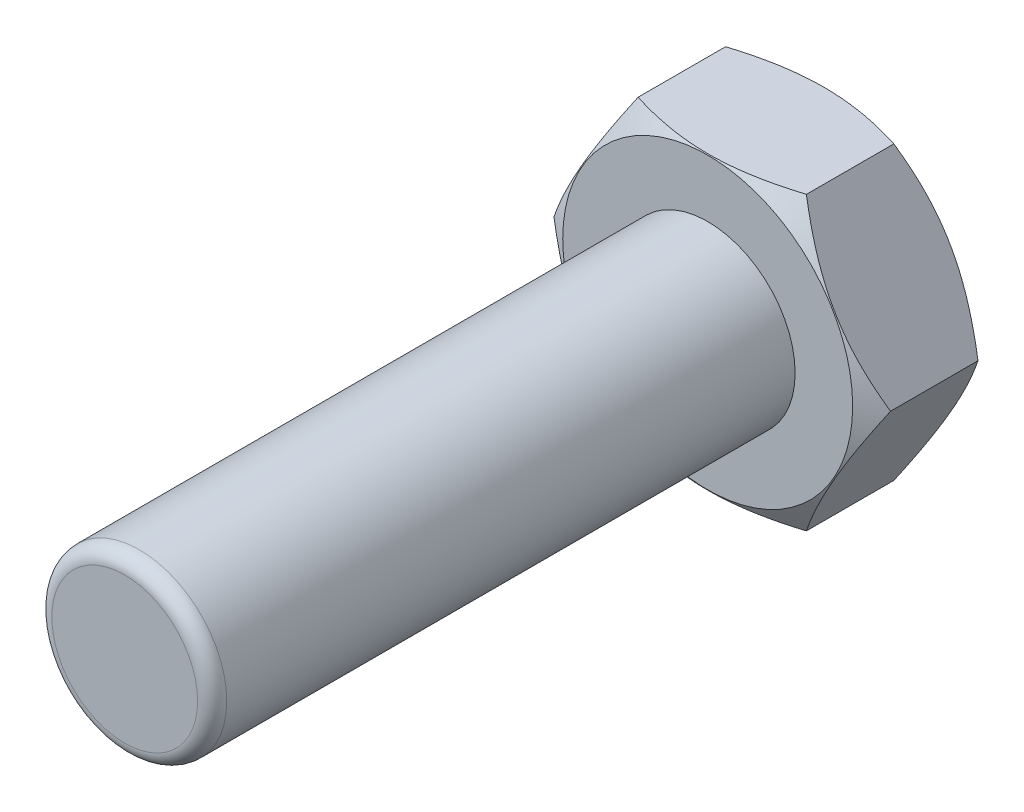
ISO-10303-21;
HEADER;
FILE_DESCRIPTION(('STEP AP214'),'2;1');
FILE_NAME('part.step','',(''),(''),'','','');
FILE_SCHEMA(('AUTOMOTIVE_DESIGN { 1 0 10303 214 1 1 1 1 }'));
ENDSEC;
DATA;
#1=APPLICATION_CONTEXT('core data for automotive mechanical design processes');
#2=APPLICATION_PROTOCOL_DEFINITION('international standard','automotive_design',2000,#1);
#3=PRODUCT_CONTEXT('',#1,'mechanical');
#4=PRODUCT('Part','Part','',(#3));
#5=PRODUCT_RELATED_PRODUCT_CATEGORY('part','',(#4));
#6=PRODUCT_DEFINITION_FORMATION('','',#4);
#7=PRODUCT_DEFINITION_CONTEXT('part definition',#1,'design');
#8=PRODUCT_DEFINITION('design','',#6,#7);
#9=PRODUCT_DEFINITION_SHAPE('','',#8);
#10=(LENGTH_UNIT() NAMED_UNIT(*) SI_UNIT(.MILLI.,.METRE.));
#11=(NAMED_UNIT(*) PLANE_ANGLE_UNIT() SI_UNIT($,.RADIAN.));
#12=(NAMED_UNIT(*) SI_UNIT($,.STERADIAN.) SOLID_ANGLE_UNIT());
#13=UNCERTAINTY_MEASURE_WITH_UNIT(LENGTH_MEASURE(1.E-05),#10,'distance_accuracy_value','');
#14=(GEOMETRIC_REPRESENTATION_CONTEXT(3) GLOBAL_UNCERTAINTY_ASSIGNED_CONTEXT((#13)) GLOBAL_UNIT_ASSIGNED_CONTEXT((#10,
#11,#12)) REPRESENTATION_CONTEXT('',''));
#15=CARTESIAN_POINT('',(0.,0.,0.));
#16=DIRECTION('',(0.,0.,1.));
#17=DIRECTION('',(1.,0.,0.));
#18=AXIS2_PLACEMENT_3D('',#15,#16,#17);
#19=CARTESIAN_POINT('',(0.,0.,4.));
#20=DIRECTION('',(0.,0.,1.));
#21=DIRECTION('',(1.,0.,0.));
#22=AXIS2_PLACEMENT_3D('',#19,#20,#21);
#23=PLANE('',#22);
#24=CARTESIAN_POINT('',(0.,0.,4.));
#25=DIRECTION('',(0.,0.,1.));
#26=DIRECTION('',(1.,0.,0.));
#27=AXIS2_PLACEMENT_3D('',#24,#25,#26);
#28=CIRCLE('',#27,3.);
#29=CARTESIAN_POINT('',(3.,0.,4.));
#30=VERTEX_POINT('',#29);
#31=EDGE_CURVE('E123',#30,#30,#28,.T.);
#32=ORIENTED_EDGE('',*,*,#31,.F.);
#33=EDGE_LOOP('',(#32));
#34=FACE_BOUND('',#33,.T.);
#35=CARTESIAN_POINT('',(0.,0.,4.));
#36=DIRECTION('',(0.,0.,-1.));
#37=DIRECTION('',(-1.,0.,0.));
#38=AXIS2_PLACEMENT_3D('',#35,#36,#37);
#39=CIRCLE('',#38,4.97350269189626);
#40=CARTESIAN_POINT('',(-4.97350269189626,0.,4.));
#41=VERTEX_POINT('',#40);
#42=EDGE_CURVE('E135',#41,#41,#39,.T.);
#43=ORIENTED_EDGE('',*,*,#42,.F.);
#44=EDGE_LOOP('',(#43));
#45=FACE_BOUND('',#44,.T.);
#46=ADVANCED_FACE('F38',(#34,#45),#23,.T.);
#47=CARTESIAN_POINT('',(0.,0.,4.));
#48=DIRECTION('',(0.,0.,-1.));
#49=DIRECTION('',(-1.,0.,0.));
#50=AXIS2_PLACEMENT_3D('',#47,#48,#49);
#51=CONICAL_SURFACE('',#50,4.97350269189626,1.01219701145134);
#52=ORIENTED_EDGE('',*,*,#42,.T.);
#53=EDGE_LOOP('',(#52));
#54=FACE_BOUND('',#53,.T.);
#55=CARTESIAN_POINT('',(2.88663587589429,5.0002,3.49992782905134));
#56=CARTESIAN_POINT('',(3.01440818351032,4.77889187140871,3.57983069288711));
#57=CARTESIAN_POINT('',(3.14350838469547,4.55528376368868,3.65255832475134));
#58=CARTESIAN_POINT('',(3.404346259228,4.10349931246006,3.77942971021989));
#59=CARTESIAN_POINT('',(3.53609053308568,3.87531153653229,3.8335185802931));
#60=CARTESIAN_POINT('',(3.73320124266504,3.53390577282487,3.89654033518077));
#61=CARTESIAN_POINT('',(3.79785381691391,3.42192422938572,3.91438943130841));
#62=CARTESIAN_POINT('',(3.92749478060733,3.19737949352652,3.94417152378572));
#63=CARTESIAN_POINT('',(3.99248313360478,3.08481636423471,3.95610514914306));
#64=CARTESIAN_POINT('',(4.12258249153659,2.85947766626473,3.97372919788762));
#65=CARTESIAN_POINT('',(4.1876931985735,2.74670261356007,3.97942831403867));
#66=CARTESIAN_POINT('',(4.3179705263716,2.52105566273945,3.98446349373415));
#67=CARTESIAN_POINT('',(4.3831371448082,2.40818376864981,3.98379981011162));
#68=CARTESIAN_POINT('',(4.5593582112848,2.10295992814837,3.97338846903842));
#69=CARTESIAN_POINT('',(4.67033513399223,1.91074225955146,3.95755957629238));
#70=CARTESIAN_POINT('',(4.89141814185484,1.52781525724327,3.90854363890215));
#71=CARTESIAN_POINT('',(5.00152313552289,1.33710781404316,3.87533753057275));
#72=CARTESIAN_POINT('',(5.2230973202214,0.953330068499689,3.7927773100555));
#73=CARTESIAN_POINT('',(5.33452908874939,0.760324583831953,3.74303093759898));
#74=CARTESIAN_POINT('',(5.55547623077945,0.37763290804875,3.63053514487106));
#75=CARTESIAN_POINT('',(5.66499546394719,0.187940031796247,3.56781628624836));
#76=CARTESIAN_POINT('',(5.77361816195009,-0.000199999999996437,3.49992782905134));
#77=B_SPLINE_CURVE_WITH_KNOTS('',3,(#55,#56,#57,#58,#59,#60,#61,#62,#63,#64,#65,#66,#67,#68,#69,
#70,#71,#72,#73,#74,#75,#76),.UNSPECIFIED.,.F.,.F.,(4,2,2,2,2,2,2,2,2,2,4),(0.,
0.803762628060276,1.60987217964058,2.00134092758941,2.39276804069576,2.78364868938505,
3.17451380605367,3.84126989592929,4.50875898916443,5.19336506568142,5.87637629561688),.UNSPECIFIED.);
#78=CARTESIAN_POINT('',(2.88675134594812,5.,3.50000000000001));
#79=VERTEX_POINT('',#78);
#80=CARTESIAN_POINT('',(5.77350269189625,0.,3.50000000000001));
#81=VERTEX_POINT('',#80);
#82=EDGE_CURVE('E203',#79,#81,#77,.T.);
#83=ORIENTED_EDGE('',*,*,#82,.F.);
#84=CARTESIAN_POINT('',(-8.68206422951937,5.,0.8466303606251));
#85=CARTESIAN_POINT('',(-8.48984229753325,5.,0.950725897578672));
#86=CARTESIAN_POINT('',(-8.29726786175632,5.,1.05417622325729));
#87=CARTESIAN_POINT('',(-7.91127347550846,5.,1.2594985898648));
#88=CARTESIAN_POINT('',(-7.71785350307147,5.,1.36137058947439));
#89=CARTESIAN_POINT('',(-7.32973420920897,5.,1.56340088051147));
#90=CARTESIAN_POINT('',(-7.13503335969796,5.,1.66355624158371));
#91=CARTESIAN_POINT('',(-6.74447923577921,5.,1.86160384231195));
#92=CARTESIAN_POINT('',(-6.5486259471362,5.,1.95949605393892));
#93=CARTESIAN_POINT('',(-6.1464765984649,5.,2.15699563488297));
#94=CARTESIAN_POINT('',(-5.9401164909889,5.,2.25647294387211));
#95=CARTESIAN_POINT('',(-5.52564207752673,5.,2.4517001259967));
#96=CARTESIAN_POINT('',(-5.31752781829277,5.,2.5474500980946));
#97=CARTESIAN_POINT('',(-4.89934164762169,5.,2.73423578293052));
#98=CARTESIAN_POINT('',(-4.68927105681937,5.,2.82527443739985));
#99=CARTESIAN_POINT('',(-4.26662661952907,5.,3.00150319452745));
#100=CARTESIAN_POINT('',(-4.05405221733985,5.,3.08669196906338));
#101=CARTESIAN_POINT('',(-3.57313414137314,5.,3.26977874676671));
#102=CARTESIAN_POINT('',(-3.30399297837284,5.,3.36561353706304));
#103=CARTESIAN_POINT('',(-2.760718975345,5.,3.54168391872462));
#104=CARTESIAN_POINT('',(-2.48658850076104,5.,3.621926701917));
#105=CARTESIAN_POINT('',(-1.93783397042625,5.,3.76054063429166));
#106=CARTESIAN_POINT('',(-1.66330459966289,5.,3.81927389577143));
#107=CARTESIAN_POINT('',(-1.24842593126023,5.,3.88858112005756));
#108=CARTESIAN_POINT('',(-1.10962341220003,5.,3.90855107983616));
#109=CARTESIAN_POINT('',(-0.831217777316687,5.,3.94170090588461));
#110=CARTESIAN_POINT('',(-0.691614784314176,5.,3.95488178706191));
#111=CARTESIAN_POINT('',(-0.409902306306319,5.,3.97419415083215));
#112=CARTESIAN_POINT('',(-0.267785630771032,5.,3.98022161089371));
#113=CARTESIAN_POINT('',(0.0165671641632497,5.,3.9846848551111));
#114=CARTESIAN_POINT('',(0.158803282987744,5.,3.98312067557459));
#115=CARTESIAN_POINT('',(0.443007126762322,5.,3.97244992582317));
#116=CARTESIAN_POINT('',(0.584974820194396,5.,3.96334251908101));
#117=CARTESIAN_POINT('',(0.868248164811933,5.,3.93788511467705));
#118=CARTESIAN_POINT('',(1.00955380329963,5.,3.9215349786746));
#119=CARTESIAN_POINT('',(1.43732445023272,5.,3.86157271584852));
#120=CARTESIAN_POINT('',(1.72232454673964,5.,3.80727410899934));
#121=CARTESIAN_POINT('',(2.28693891359293,5.,3.67599588211175));
#122=CARTESIAN_POINT('',(2.56655131572725,5.,3.59900854022744));
#123=CARTESIAN_POINT('',(3.10615883441639,5.,3.43228623018333));
#124=CARTESIAN_POINT('',(3.36642379658694,5.,3.34340933943089));
#125=CARTESIAN_POINT('',(3.88271763716103,5.,3.15402190339427));
#126=CARTESIAN_POINT('',(4.13874526181275,5.,3.05350798285101));
#127=CARTESIAN_POINT('',(4.64756504944396,5.,2.84360736898123));
#128=CARTESIAN_POINT('',(4.90035165009461,5.,2.73420730846554));
#129=CARTESIAN_POINT('',(5.40291352612098,5.,2.5088098541549));
#130=CARTESIAN_POINT('',(5.652689141842,5.,2.39281321463871));
#131=CARTESIAN_POINT('',(6.13691988050156,5.,2.16190457091515));
#132=CARTESIAN_POINT('',(6.3714975890836,5.,2.0472484653541));
#133=CARTESIAN_POINT('',(6.83886979381447,5.,1.81434353837332));
#134=CARTESIAN_POINT('',(7.07166421804627,5.,1.6960945730044));
#135=CARTESIAN_POINT('',(7.53476239036373,5.,1.45726515370921));
#136=CARTESIAN_POINT('',(7.76507257776221,5.,1.33669715181898));
#137=CARTESIAN_POINT('',(8.22444085723045,5.,1.09326215557269));
#138=CARTESIAN_POINT('',(8.45349909442037,5.,0.970395435303225));
#139=CARTESIAN_POINT('',(8.68206422951936,5.,0.846630360625118));
#140=B_SPLINE_CURVE_WITH_KNOTS('',3,(#84,#85,#86,#87,#88,#89,#90,#91,#92,#93,#94,#95,#96,#97,
#98,#99,#100,#101,#102,#103,#104,#105,#106,#107,#108,#109,#110,#111,#112,#113,#114,#115,#116,
#117,#118,#119,#120,#121,#122,#123,#124,#125,#126,#127,#128,#129,#130,#131,#132,#133,#134,#135,
#136,#137,#138,#139),.UNSPECIFIED.,.F.,.F.,(4,2,2,2,2,2,2,2,2,2,2,2,2,2,2,2,2,2,2,2,2,2,2,2,2,2,
2,4),(0.,0.655797273333695,1.31161168599699,1.96845209151456,2.62530062762448,3.31252740730559,
3.99973592835046,4.68651004919489,5.3734395791909,6.23016015262014,7.08648461997412,
7.92764658090532,8.34820075809762,8.76869204788468,9.19522584633638,9.62175760485626,
10.0483366711417,10.4749238857054,11.3439958649752,12.2133639649891,13.038069607074,
13.8630150527807,14.6892252790543,15.5153412224169,16.2986012444029,17.081892689463,
17.8617599306687,18.641534770027),.UNSPECIFIED.);
#141=CARTESIAN_POINT('',(-2.88675134594814,5.,3.5));
#142=VERTEX_POINT('',#141);
#143=EDGE_CURVE('E212',#142,#79,#140,.T.);
#144=ORIENTED_EDGE('',*,*,#143,.F.);
#145=CARTESIAN_POINT('',(-5.7736181619501,-0.000199999999999897,3.49992782905133));
#146=CARTESIAN_POINT('',(-5.64584585433406,0.22110812859129,3.57983069288711));
#147=CARTESIAN_POINT('',(-5.51674565314892,0.444716236311329,3.65255832475134));
#148=CARTESIAN_POINT('',(-5.25590777861639,0.896500687539946,3.77942971021988));
#149=CARTESIAN_POINT('',(-5.12416350475871,1.12468846346771,3.83351858029309));
#150=CARTESIAN_POINT('',(-4.92705279517934,1.46609422717513,3.89654033518077));
#151=CARTESIAN_POINT('',(-4.86240022093048,1.57807577061428,3.9143894313084));
#152=CARTESIAN_POINT('',(-4.73275925723706,1.80262050647348,3.94417152378571));
#153=CARTESIAN_POINT('',(-4.6677709042396,1.91518363576529,3.95610514914306));
#154=CARTESIAN_POINT('',(-4.5376715463078,2.14052233373527,3.97372919788761));
#155=CARTESIAN_POINT('',(-4.47256083927088,2.25329738643994,3.97942831403867));
#156=CARTESIAN_POINT('',(-4.34228351147278,2.47894433726055,3.98446349373414));
#157=CARTESIAN_POINT('',(-4.27711689303619,2.59181623135019,3.98379981011161));
#158=CARTESIAN_POINT('',(-4.10089582655959,2.89704007185164,3.97338846903841));
#159=CARTESIAN_POINT('',(-3.98991890385216,3.08925774044854,3.95755957629237));
#160=CARTESIAN_POINT('',(-3.76883589598955,3.47218474275674,3.90854363890214));
#161=CARTESIAN_POINT('',(-3.6587309023215,3.66289218595685,3.87533753057274));
#162=CARTESIAN_POINT('',(-3.43715671762299,4.04666993150032,3.79277731005549));
#163=CARTESIAN_POINT('',(-3.325724949095,4.23967541616805,3.74303093759897));
#164=CARTESIAN_POINT('',(-3.10477780706494,4.62236709195126,3.63053514487105));
#165=CARTESIAN_POINT('',(-2.9952585738972,4.81205996820376,3.56781628624835));
#166=CARTESIAN_POINT('',(-2.88663587589429,5.0002,3.49992782905133));
#167=B_SPLINE_CURVE_WITH_KNOTS('',3,(#145,#146,#147,#148,#149,#150,#151,#152,#153,#154,#155,
#156,#157,#158,#159,#160,#161,#162,#163,#164,#165,#166),.UNSPECIFIED.,.F.,.F.,(4,2,2,2,2,2,2,2,
2,2,4),(0.,0.803762628060276,1.60987217964058,2.00134092758941,2.39276804069576,
2.78364868938505,3.17451380605367,3.84126989592929,4.50875898916443,5.19336506568142,
5.87637629561688),.UNSPECIFIED.);
#168=CARTESIAN_POINT('',(-5.77350269189626,0.,3.5));
#169=VERTEX_POINT('',#168);
#170=EDGE_CURVE('E229',#169,#142,#167,.T.);
#171=ORIENTED_EDGE('',*,*,#170,.F.);
#172=CARTESIAN_POINT('',(-2.88663587589429,-5.0002,3.49992782905133));
#173=CARTESIAN_POINT('',(-3.01440818351033,-4.77889187140871,3.57983069288711));
#174=CARTESIAN_POINT('',(-3.14350838469547,-4.55528376368868,3.65255832475134));
#175=CARTESIAN_POINT('',(-3.404346259228,-4.10349931246006,3.77942971021988));
#176=CARTESIAN_POINT('',(-3.53609053308568,-3.87531153653229,3.83351858029309));
#177=CARTESIAN_POINT('',(-3.73320124266505,-3.53390577282487,3.89654033518077));
#178=CARTESIAN_POINT('',(-3.79785381691391,-3.42192422938572,3.9143894313084));
#179=CARTESIAN_POINT('',(-3.92749478060733,-3.19737949352652,3.94417152378571));
#180=CARTESIAN_POINT('',(-3.99248313360479,-3.08481636423471,3.95610514914306));
#181=CARTESIAN_POINT('',(-4.12258249153659,-2.85947766626473,3.97372919788761));
#182=CARTESIAN_POINT('',(-4.18769319857351,-2.74670261356007,3.97942831403867));
#183=CARTESIAN_POINT('',(-4.31797052637161,-2.52105566273945,3.98446349373414));
#184=CARTESIAN_POINT('',(-4.3831371448082,-2.40818376864981,3.98379981011161));
#185=CARTESIAN_POINT('',(-4.55935821128481,-2.10295992814836,3.97338846903841));
#186=CARTESIAN_POINT('',(-4.67033513399223,-1.91074225955146,3.95755957629237));
#187=CARTESIAN_POINT('',(-4.89141814185484,-1.52781525724327,3.90854363890214));
#188=CARTESIAN_POINT('',(-5.00152313552289,-1.33710781404316,3.87533753057274));
#189=CARTESIAN_POINT('',(-5.2230973202214,-0.953330068499686,3.79277731005549));
#190=CARTESIAN_POINT('',(-5.33452908874939,-0.76032458383195,3.74303093759897));
#191=CARTESIAN_POINT('',(-5.55547623077946,-0.377632908048746,3.63053514487105));
#192=CARTESIAN_POINT('',(-5.66499546394719,-0.187940031796243,3.56781628624835));
#193=CARTESIAN_POINT('',(-5.7736181619501,0.000200000000000291,3.49992782905133));
#194=B_SPLINE_CURVE_WITH_KNOTS('',3,(#172,#173,#174,#175,#176,#177,#178,#179,#180,#181,#182,
#183,#184,#185,#186,#187,#188,#189,#190,#191,#192,#193),.UNSPECIFIED.,.F.,.F.,(4,2,2,2,2,2,2,2,
2,2,4),(0.,0.803762628060276,1.60987217964058,2.00134092758941,2.39276804069576,
2.78364868938505,3.17451380605367,3.84126989592929,4.50875898916443,5.19336506568142,
5.87637629561688),.UNSPECIFIED.);
#195=CARTESIAN_POINT('',(-2.88675134594813,-5.,3.5));
#196=VERTEX_POINT('',#195);
#197=EDGE_CURVE('E53',#196,#169,#194,.T.);
#198=ORIENTED_EDGE('',*,*,#197,.F.);
#199=CARTESIAN_POINT('',(8.68206422951936,-5.,0.846630360625117));
#200=CARTESIAN_POINT('',(8.48984229753324,-5.,0.950725897578687));
#201=CARTESIAN_POINT('',(8.29726786175631,-5.,1.05417622325731));
#202=CARTESIAN_POINT('',(7.91127347550846,-5.,1.25949858986481));
#203=CARTESIAN_POINT('',(7.71785350307146,-5.,1.3613705894744));
#204=CARTESIAN_POINT('',(7.32973420920897,-5.,1.56340088051148));
#205=CARTESIAN_POINT('',(7.13503335969795,-5.,1.66355624158372));
#206=CARTESIAN_POINT('',(6.7444792357792,-5.,1.86160384231196));
#207=CARTESIAN_POINT('',(6.54862594713619,-5.,1.95949605393893));
#208=CARTESIAN_POINT('',(6.14647659846489,-5.,2.15699563488298));
#209=CARTESIAN_POINT('',(5.94011649098889,-5.,2.25647294387212));
#210=CARTESIAN_POINT('',(5.52564207752672,-5.,2.45170012599672));
#211=CARTESIAN_POINT('',(5.31752781829277,-5.,2.54745009809461));
#212=CARTESIAN_POINT('',(4.89934164762168,-5.,2.73423578293053));
#213=CARTESIAN_POINT('',(4.68927105681936,-5.,2.82527443739986));
#214=CARTESIAN_POINT('',(4.26662661952906,-5.,3.00150319452746));
#215=CARTESIAN_POINT('',(4.05405221733985,-5.,3.08669196906339));
#216=CARTESIAN_POINT('',(3.57313414137313,-5.,3.26977874676672));
#217=CARTESIAN_POINT('',(3.30399297837283,-5.,3.36561353706305));
#218=CARTESIAN_POINT('',(2.760718975345,-5.,3.54168391872463));
#219=CARTESIAN_POINT('',(2.48658850076103,-5.,3.62192670191701));
#220=CARTESIAN_POINT('',(1.93783397042624,-5.,3.76054063429166));
#221=CARTESIAN_POINT('',(1.66330459966288,-5.,3.81927389577143));
#222=CARTESIAN_POINT('',(1.24842593126023,-5.,3.88858112005756));
#223=CARTESIAN_POINT('',(1.10962341220002,-5.,3.90855107983616));
#224=CARTESIAN_POINT('',(0.83121777731668,-5.,3.94170090588461));
#225=CARTESIAN_POINT('',(0.691614784314169,-5.,3.95488178706192));
#226=CARTESIAN_POINT('',(0.409902306306312,-5.,3.97419415083215));
#227=CARTESIAN_POINT('',(0.267785630771025,-5.,3.98022161089371));
#228=CARTESIAN_POINT('',(-0.0165671641632574,-5.,3.9846848551111));
#229=CARTESIAN_POINT('',(-0.158803282987752,-5.,3.98312067557459));
#230=CARTESIAN_POINT('',(-0.44300712676233,-5.,3.97244992582317));
#231=CARTESIAN_POINT('',(-0.584974820194403,-5.,3.96334251908101));
#232=CARTESIAN_POINT('',(-0.868248164811941,-5.,3.93788511467705));
#233=CARTESIAN_POINT('',(-1.00955380329964,-5.,3.92153497867459));
#234=CARTESIAN_POINT('',(-1.43732445023273,-5.,3.86157271584852));
#235=CARTESIAN_POINT('',(-1.72232454673964,-5.,3.80727410899934));
#236=CARTESIAN_POINT('',(-2.28693891359293,-5.,3.67599588211175));
#237=CARTESIAN_POINT('',(-2.56655131572725,-5.,3.59900854022743));
#238=CARTESIAN_POINT('',(-3.1061588344164,-5.,3.43228623018332));
#239=CARTESIAN_POINT('',(-3.36642379658694,-5.,3.34340933943088));
#240=CARTESIAN_POINT('',(-3.88271763716103,-5.,3.15402190339426));
#241=CARTESIAN_POINT('',(-4.13874526181275,-5.,3.053507982851));
#242=CARTESIAN_POINT('',(-4.64756504944397,-5.,2.84360736898122));
#243=CARTESIAN_POINT('',(-4.90035165009461,-5.,2.73420730846553));
#244=CARTESIAN_POINT('',(-5.40291352612098,-5.,2.50880985415489));
#245=CARTESIAN_POINT('',(-5.65268914184201,-5.,2.3928132146387));
#246=CARTESIAN_POINT('',(-6.13691988050157,-5.,2.16190457091514));
#247=CARTESIAN_POINT('',(-6.37149758908361,-5.,2.04724846535409));
#248=CARTESIAN_POINT('',(-6.83886979381448,-5.,1.81434353837331));
#249=CARTESIAN_POINT('',(-7.07166421804628,-5.,1.69609457300439));
#250=CARTESIAN_POINT('',(-7.53476239036374,-5.,1.45726515370919));
#251=CARTESIAN_POINT('',(-7.76507257776221,-5.,1.33669715181896));
#252=CARTESIAN_POINT('',(-8.22444085723046,-5.,1.09326215557268));
#253=CARTESIAN_POINT('',(-8.45349909442038,-5.,0.970395435303208));
#254=CARTESIAN_POINT('',(-8.68206422951937,-5.,0.8466303606251));
#255=B_SPLINE_CURVE_WITH_KNOTS('',3,(#199,#200,#201,#202,#203,#204,#205,#206,#207,#208,#209,
#210,#211,#212,#213,#214,#215,#216,#217,#218,#219,#220,#221,#222,#223,#224,#225,#226,#227,#228,
#229,#230,#231,#232,#233,#234,#235,#236,#237,#238,#239,#240,#241,#242,#243,#244,#245,#246,#247,
#248,#249,#250,#251,#252,#253,#254),.UNSPECIFIED.,.F.,.F.,(4,2,2,2,2,2,2,2,2,2,2,2,2,2,2,2,2,2,
2,2,2,2,2,2,2,2,2,4),(0.,0.655797273333696,1.31161168599699,1.96845209151456,2.62530062762449,
3.31252740730559,3.99973592835046,4.68651004919489,5.3734395791909,6.23016015262013,
7.08648461997411,7.92764658090532,8.34820075809761,8.76869204788468,9.19522584633637,
9.62175760485625,10.0483366711417,10.4749238857054,11.3439958649752,12.2133639649891,
13.038069607074,13.8630150527807,14.6892252790543,15.5153412224169,16.2986012444029,
17.081892689463,17.8617599306687,18.641534770027),.UNSPECIFIED.);
#256=CARTESIAN_POINT('',(2.88675134594812,-5.,3.50000000000001));
#257=VERTEX_POINT('',#256);
#258=EDGE_CURVE('E228',#257,#196,#255,.T.);
#259=ORIENTED_EDGE('',*,*,#258,.F.);
#260=CARTESIAN_POINT('',(5.77361816195009,0.000200000000003558,3.49992782905134));
#261=CARTESIAN_POINT('',(5.64584585433406,-0.221108128591287,3.57983069288712));
#262=CARTESIAN_POINT('',(5.51674565314891,-0.444716236311326,3.65255832475135));
#263=CARTESIAN_POINT('',(5.25590777861638,-0.896500687539943,3.77942971021989));
#264=CARTESIAN_POINT('',(5.12416350475871,-1.12468846346771,3.8335185802931));
#265=CARTESIAN_POINT('',(4.92705279517934,-1.46609422717513,3.89654033518077));
#266=CARTESIAN_POINT('',(4.86240022093047,-1.57807577061428,3.91438943130841));
#267=CARTESIAN_POINT('',(4.73275925723705,-1.80262050647348,3.94417152378572));
#268=CARTESIAN_POINT('',(4.6677709042396,-1.91518363576529,3.95610514914306));
#269=CARTESIAN_POINT('',(4.53767154630779,-2.14052233373527,3.97372919788762));
#270=CARTESIAN_POINT('',(4.47256083927088,-2.25329738643993,3.97942831403867));
#271=CARTESIAN_POINT('',(4.34228351147278,-2.47894433726055,3.98446349373415));
#272=CARTESIAN_POINT('',(4.27711689303618,-2.59181623135019,3.98379981011162));
#273=CARTESIAN_POINT('',(4.10089582655958,-2.89704007185164,3.97338846903842));
#274=CARTESIAN_POINT('',(3.98991890385216,-3.08925774044854,3.95755957629238));
#275=CARTESIAN_POINT('',(3.76883589598954,-3.47218474275673,3.90854363890215));
#276=CARTESIAN_POINT('',(3.6587309023215,-3.66289218595684,3.87533753057274));
#277=CARTESIAN_POINT('',(3.43715671762299,-4.04666993150032,3.7927773100555));
#278=CARTESIAN_POINT('',(3.32572494909499,-4.23967541616805,3.74303093759897));
#279=CARTESIAN_POINT('',(3.10477780706493,-4.62236709195126,3.63053514487105));
#280=CARTESIAN_POINT('',(2.9952585738972,-4.81205996820376,3.56781628624836));
#281=CARTESIAN_POINT('',(2.88663587589429,-5.0002,3.49992782905134));
#282=B_SPLINE_CURVE_WITH_KNOTS('',3,(#260,#261,#262,#263,#264,#265,#266,#267,#268,#269,#270,
#271,#272,#273,#274,#275,#276,#277,#278,#279,#280,#281),.UNSPECIFIED.,.F.,.F.,(4,2,2,2,2,2,2,2,
2,2,4),(0.,0.803762628060276,1.60987217964058,2.00134092758941,2.39276804069576,
2.78364868938505,3.17451380605367,3.84126989592929,4.50875898916443,5.19336506568142,
5.87637629561688),.UNSPECIFIED.);
#283=EDGE_CURVE('E211',#81,#257,#282,.T.);
#284=ORIENTED_EDGE('',*,*,#283,.F.);
#285=EDGE_LOOP('',(#83,#144,#171,#198,#259,#284));
#286=FACE_BOUND('',#285,.T.);
#287=ADVANCED_FACE('F160',(#54,#286),#51,.T.);
#288=CARTESIAN_POINT('',(2.88675134594813,-5.,4.));
#289=DIRECTION('',(-0.866025403784439,0.499999999999999,0.));
#290=DIRECTION('',(-0.499999999999999,-0.866025403784439,0.));
#291=AXIS2_PLACEMENT_3D('',#288,#289,#290);
#292=PLANE('',#291);
#293=DIRECTION('',(0.,0.,-1.));
#294=VECTOR('',#293,1.);
#295=CARTESIAN_POINT('',(2.88675134594813,-5.,4.));
#296=LINE('',#295,#294);
#297=CARTESIAN_POINT('',(2.88675134594813,-5.,0.500000000000008));
#298=VERTEX_POINT('',#297);
#299=EDGE_CURVE('E115',#257,#298,#296,.T.);
#300=ORIENTED_EDGE('',*,*,#299,.T.);
#301=CARTESIAN_POINT('',(2.88663587589429,-5.0002,0.500072170948677));
#302=CARTESIAN_POINT('',(3.01440818351032,-4.77889187140871,0.4201693071129));
#303=CARTESIAN_POINT('',(3.14350838469547,-4.55528376368868,0.34744167524867));
#304=CARTESIAN_POINT('',(3.404346259228,-4.10349931246006,0.220570289780123));
#305=CARTESIAN_POINT('',(3.53609053308568,-3.87531153653229,0.166481419706915));
#306=CARTESIAN_POINT('',(3.73320124266504,-3.53390577282487,0.10345966481924));
#307=CARTESIAN_POINT('',(3.79785381691391,-3.42192422938572,0.085610568691601));
#308=CARTESIAN_POINT('',(3.92749478060733,-3.19737949352652,0.0558284762142912));
#309=CARTESIAN_POINT('',(3.99248313360479,-3.08481636423471,0.0438948508569506));
#310=CARTESIAN_POINT('',(4.12258249153659,-2.85947766626473,0.0262708021123915));
#311=CARTESIAN_POINT('',(4.1876931985735,-2.74670261356006,0.0205716859613396));
#312=CARTESIAN_POINT('',(4.3179705263716,-2.52105566273945,0.0155365062658656));
#313=CARTESIAN_POINT('',(4.3831371448082,-2.40818376864981,0.0162001898883919));
#314=CARTESIAN_POINT('',(4.5593582112848,-2.10295992814836,0.0266115309615972));
#315=CARTESIAN_POINT('',(4.67033513399223,-1.91074225955146,0.042440423707635));
#316=CARTESIAN_POINT('',(4.89141814185484,-1.52781525724326,0.0914563610978608));
#317=CARTESIAN_POINT('',(5.00152313552289,-1.33710781404315,0.124662469427268));
#318=CARTESIAN_POINT('',(5.2230973202214,-0.953330068499683,0.207222689944513));
#319=CARTESIAN_POINT('',(5.33452908874939,-0.760324583831946,0.256969062401037));
#320=CARTESIAN_POINT('',(5.55547623077945,-0.377632908048742,0.369464855128959));
#321=CARTESIAN_POINT('',(5.66499546394719,-0.187940031796239,0.432183713751654));
#322=CARTESIAN_POINT('',(5.77361816195009,0.000200000000004034,0.500072170948676));
#323=B_SPLINE_CURVE_WITH_KNOTS('',3,(#301,#302,#303,#304,#305,#306,#307,#308,#309,#310,#311,
#312,#313,#314,#315,#316,#317,#318,#319,#320,#321,#322),.UNSPECIFIED.,.F.,.F.,(4,2,2,2,2,2,2,2,
2,2,4),(0.,0.803762628060278,1.60987217964058,2.00134092758941,2.39276804069576,
2.78364868938505,3.17451380605367,3.8412698959293,4.50875898916443,5.19336506568142,
5.87637629561689),.UNSPECIFIED.);
#324=CARTESIAN_POINT('',(5.77350269189626,0.,0.50000000000001));
#325=VERTEX_POINT('',#324);
#326=EDGE_CURVE('E61',#298,#325,#323,.T.);
#327=ORIENTED_EDGE('',*,*,#326,.T.);
#328=DIRECTION('',(0.,0.,-1.));
#329=VECTOR('',#328,1.);
#330=CARTESIAN_POINT('',(5.77350269189626,0.,4.));
#331=LINE('',#330,#329);
#332=EDGE_CURVE('E121',#81,#325,#331,.T.);
#333=ORIENTED_EDGE('',*,*,#332,.F.);
#334=ORIENTED_EDGE('',*,*,#283,.T.);
#335=EDGE_LOOP('',(#300,#327,#333,#334));
#336=FACE_BOUND('',#335,.T.);
#337=ADVANCED_FACE('F197',(#336),#292,.F.);
#338=CARTESIAN_POINT('',(5.77350269189626,0.,4.));
#339=DIRECTION('',(-0.866025403784439,-0.5,0.));
#340=DIRECTION('',(0.5,-0.866025403784438,0.));
#341=AXIS2_PLACEMENT_3D('',#338,#339,#340);
#342=PLANE('',#341);
#343=ORIENTED_EDGE('',*,*,#332,.T.);
#344=CARTESIAN_POINT('',(5.77361816195009,-0.000199999999996479,0.500072170948677));
#345=CARTESIAN_POINT('',(5.64584585433406,0.221108128591293,0.420169307112899));
#346=CARTESIAN_POINT('',(5.51674565314891,0.444716236311331,0.34744167524867));
#347=CARTESIAN_POINT('',(5.25590777861638,0.896500687539949,0.220570289780124));
#348=CARTESIAN_POINT('',(5.12416350475871,1.12468846346771,0.166481419706916));
#349=CARTESIAN_POINT('',(4.92705279517934,1.46609422717513,0.10345966481924));
#350=CARTESIAN_POINT('',(4.86240022093047,1.57807577061429,0.0856105686916015));
#351=CARTESIAN_POINT('',(4.73275925723705,1.80262050647348,0.0558284762142918));
#352=CARTESIAN_POINT('',(4.6677709042396,1.9151836357653,0.0438948508569512));
#353=CARTESIAN_POINT('',(4.53767154630779,2.14052233373527,0.0262708021123924));
#354=CARTESIAN_POINT('',(4.47256083927088,2.25329738643994,0.0205716859613407));
#355=CARTESIAN_POINT('',(4.34228351147278,2.47894433726056,0.0155365062658665));
#356=CARTESIAN_POINT('',(4.27711689303618,2.59181623135019,0.0162001898883923));
#357=CARTESIAN_POINT('',(4.10089582655958,2.89704007185164,0.026611530961597));
#358=CARTESIAN_POINT('',(3.98991890385215,3.08925774044855,0.0424404237076354));
#359=CARTESIAN_POINT('',(3.76883589598954,3.47218474275674,0.0914563610978614));
#360=CARTESIAN_POINT('',(3.65873090232149,3.66289218595685,0.124662469427268));
#361=CARTESIAN_POINT('',(3.43715671762298,4.04666993150032,0.207222689944513));
#362=CARTESIAN_POINT('',(3.32572494909499,4.23967541616805,0.256969062401037));
#363=CARTESIAN_POINT('',(3.10477780706493,4.62236709195126,0.369464855128959));
#364=CARTESIAN_POINT('',(2.99525857389719,4.81205996820376,0.432183713751654));
#365=CARTESIAN_POINT('',(2.88663587589429,5.0002,0.500072170948677));
#366=B_SPLINE_CURVE_WITH_KNOTS('',3,(#344,#345,#346,#347,#348,#349,#350,#351,#352,#353,#354,
#355,#356,#357,#358,#359,#360,#361,#362,#363,#364,#365),.UNSPECIFIED.,.F.,.F.,(4,2,2,2,2,2,2,2,
2,2,4),(0.,0.803762628060276,1.60987217964058,2.00134092758941,2.39276804069576,
2.78364868938505,3.17451380605367,3.84126989592929,4.50875898916443,5.19336506568142,
5.87637629561688),.UNSPECIFIED.);
#367=CARTESIAN_POINT('',(2.88675134594813,5.,0.500000000000007));
#368=VERTEX_POINT('',#367);
#369=EDGE_CURVE('E181',#325,#368,#366,.T.);
#370=ORIENTED_EDGE('',*,*,#369,.T.);
#371=DIRECTION('',(0.,0.,-1.));
#372=VECTOR('',#371,1.);
#373=CARTESIAN_POINT('',(2.88675134594813,5.,4.));
#374=LINE('',#373,#372);
#375=EDGE_CURVE('E113',#79,#368,#374,.T.);
#376=ORIENTED_EDGE('',*,*,#375,.F.);
#377=ORIENTED_EDGE('',*,*,#82,.T.);
#378=EDGE_LOOP('',(#343,#370,#376,#377));
#379=FACE_BOUND('',#378,.T.);
#380=ADVANCED_FACE('F193',(#379),#342,.F.);
#381=CARTESIAN_POINT('',(2.88675134594813,5.,4.));
#382=DIRECTION('',(0.,-1.,0.));
#383=DIRECTION('',(0.,0.,-1.));
#384=AXIS2_PLACEMENT_3D('',#381,#382,#383);
#385=PLANE('',#384);
#386=ORIENTED_EDGE('',*,*,#375,.T.);
#387=CARTESIAN_POINT('',(8.68206422951936,5.,3.15336963937492));
#388=CARTESIAN_POINT('',(8.48984229753324,5.,3.04927410242135));
#389=CARTESIAN_POINT('',(8.29726786175631,5.,2.94582377674272));
#390=CARTESIAN_POINT('',(7.91127347550846,5.,2.74050141013522));
#391=CARTESIAN_POINT('',(7.71785350307147,5.,2.63862941052563));
#392=CARTESIAN_POINT('',(7.32973420920897,5.,2.43659911948855));
#393=CARTESIAN_POINT('',(7.13503335969796,5.,2.33644375841631));
#394=CARTESIAN_POINT('',(6.74447923577921,5.,2.13839615768807));
#395=CARTESIAN_POINT('',(6.5486259471362,5.,2.0405039460611));
#396=CARTESIAN_POINT('',(6.1464765984649,5.,1.84300436511705));
#397=CARTESIAN_POINT('',(5.9401164909889,5.,1.74352705612791));
#398=CARTESIAN_POINT('',(5.52564207752673,5.,1.54829987400331));
#399=CARTESIAN_POINT('',(5.31752781829278,5.,1.45254990190542));
#400=CARTESIAN_POINT('',(4.8993416476217,5.,1.2657642170695));
#401=CARTESIAN_POINT('',(4.68927105681938,5.,1.17472556260017));
#402=CARTESIAN_POINT('',(4.26662661952908,5.,0.998496805472564));
#403=CARTESIAN_POINT('',(4.05405221733987,5.,0.913308030936639));
#404=CARTESIAN_POINT('',(3.57313414137315,5.,0.730221253233304));
#405=CARTESIAN_POINT('',(3.30399297837286,5.,0.634386462936976));
#406=CARTESIAN_POINT('',(2.76071897534502,5.,0.458316081275391));
#407=CARTESIAN_POINT('',(2.48658850076106,5.,0.37807329808301));
#408=CARTESIAN_POINT('',(1.93783397042627,5.,0.239459365708356));
#409=CARTESIAN_POINT('',(1.66330459966291,5.,0.180726104228584));
#410=CARTESIAN_POINT('',(1.24842593126026,5.,0.11141887994245));
#411=CARTESIAN_POINT('',(1.10962341220005,5.,0.0914489201638539));
#412=CARTESIAN_POINT('',(0.83121777731671,5.,0.0582990941154014));
#413=CARTESIAN_POINT('',(0.691614784314199,5.,0.0451182129380949));
#414=CARTESIAN_POINT('',(0.409902306306344,5.,0.0258058491678561));
#415=CARTESIAN_POINT('',(0.267785630771057,5.,0.0197783891063003));
#416=CARTESIAN_POINT('',(-0.0165671641632242,5.,0.0153151448889092));
#417=CARTESIAN_POINT('',(-0.158803282987719,5.,0.0168793244254181));
#418=CARTESIAN_POINT('',(-0.443007126762296,5.,0.02755007417683));
#419=CARTESIAN_POINT('',(-0.58497482019437,5.,0.036657480918992));
#420=CARTESIAN_POINT('',(-0.868248164811907,5.,0.0621148853229522));
#421=CARTESIAN_POINT('',(-1.0095538032996,5.,0.0784650213254073));
#422=CARTESIAN_POINT('',(-1.43732445023269,5.,0.138427284151484));
#423=CARTESIAN_POINT('',(-1.72232454673961,5.,0.192725891000656));
#424=CARTESIAN_POINT('',(-2.2869389135929,5.,0.32400411788825));
#425=CARTESIAN_POINT('',(-2.56655131572722,5.,0.400991459772561));
#426=CARTESIAN_POINT('',(-3.10615883441637,5.,0.567713769816672));
#427=CARTESIAN_POINT('',(-3.36642379658691,5.,0.656590660569113));
#428=CARTESIAN_POINT('',(-3.882717637161,5.,0.845978096605731));
#429=CARTESIAN_POINT('',(-4.13874526181273,5.,0.946492017148992));
#430=CARTESIAN_POINT('',(-4.64756504944395,5.,1.15639263101877));
#431=CARTESIAN_POINT('',(-4.90035165009459,5.,1.26579269153446));
#432=CARTESIAN_POINT('',(-5.40291352612097,5.,1.49119014584511));
#433=CARTESIAN_POINT('',(-5.65268914184199,5.,1.60718678536129));
#434=CARTESIAN_POINT('',(-6.13691988050156,5.,1.83809542908486));
#435=CARTESIAN_POINT('',(-6.3714975890836,5.,1.95275153464591));
#436=CARTESIAN_POINT('',(-6.83886979381447,5.,2.18565646162669));
#437=CARTESIAN_POINT('',(-7.07166421804627,5.,2.30390542699562));
#438=CARTESIAN_POINT('',(-7.53476239036374,5.,2.54273484629081));
#439=CARTESIAN_POINT('',(-7.76507257776221,5.,2.66330284818104));
#440=CARTESIAN_POINT('',(-8.22444085723046,5.,2.90673784442733));
#441=CARTESIAN_POINT('',(-8.45349909442038,5.,3.0296045646968));
#442=CARTESIAN_POINT('',(-8.68206422951937,5.,3.15336963937491));
#443=B_SPLINE_CURVE_WITH_KNOTS('',3,(#387,#388,#389,#390,#391,#392,#393,#394,#395,#396,#397,
#398,#399,#400,#401,#402,#403,#404,#405,#406,#407,#408,#409,#410,#411,#412,#413,#414,#415,#416,
#417,#418,#419,#420,#421,#422,#423,#424,#425,#426,#427,#428,#429,#430,#431,#432,#433,#434,#435,
#436,#437,#438,#439,#440,#441,#442),.UNSPECIFIED.,.F.,.F.,(4,2,2,2,2,2,2,2,2,2,2,2,2,2,2,2,2,2,
2,2,2,2,2,2,2,2,2,4),(0.,0.655797273333694,1.31161168599699,1.96845209151456,2.62530062762448,
3.31252740730558,3.99973592835045,4.68651004919487,5.37343957919089,6.23016015262012,
7.08648461997409,7.92764658090529,8.34820075809759,8.76869204788466,9.19522584633635,
9.62175760485623,10.0483366711417,10.4749238857054,11.3439958649751,12.2133639649891,
13.0380696070739,13.8630150527807,14.6892252790543,15.5153412224169,16.2986012444029,
17.081892689463,17.8617599306687,18.641534770027),.UNSPECIFIED.);
#444=CARTESIAN_POINT('',(-2.88675134594814,5.,0.500000000000003));
#445=VERTEX_POINT('',#444);
#446=EDGE_CURVE('E108',#368,#445,#443,.T.);
#447=ORIENTED_EDGE('',*,*,#446,.T.);
#448=DIRECTION('',(0.,0.,-1.));
#449=VECTOR('',#448,1.);
#450=CARTESIAN_POINT('',(-2.88675134594813,5.,4.));
#451=LINE('',#450,#449);
#452=EDGE_CURVE('E107',#142,#445,#451,.T.);
#453=ORIENTED_EDGE('',*,*,#452,.F.);
#454=ORIENTED_EDGE('',*,*,#143,.T.);
#455=EDGE_LOOP('',(#386,#447,#453,#454));
#456=FACE_BOUND('',#455,.T.);
#457=ADVANCED_FACE('F196',(#456),#385,.F.);
#458=CARTESIAN_POINT('',(-2.88675134594813,5.,4.));
#459=DIRECTION('',(0.866025403784439,-0.5,0.));
#460=DIRECTION('',(0.5,0.866025403784439,0.));
#461=AXIS2_PLACEMENT_3D('',#458,#459,#460);
#462=PLANE('',#461);
#463=ORIENTED_EDGE('',*,*,#452,.T.);
#464=CARTESIAN_POINT('',(-2.88663587589429,5.0002,0.500072170948674));
#465=CARTESIAN_POINT('',(-3.01440818351033,4.77889187140871,0.420169307112896));
#466=CARTESIAN_POINT('',(-3.14350838469548,4.55528376368868,0.347441675248666));
#467=CARTESIAN_POINT('',(-3.404346259228,4.10349931246006,0.220570289780119));
#468=CARTESIAN_POINT('',(-3.53609053308568,3.87531153653229,0.166481419706911));
#469=CARTESIAN_POINT('',(-3.73320124266505,3.53390577282487,0.103459664819236));
#470=CARTESIAN_POINT('',(-3.79785381691392,3.42192422938572,0.0856105686915972));
#471=CARTESIAN_POINT('',(-3.92749478060734,3.19737949352652,0.0558284762142872));
#472=CARTESIAN_POINT('',(-3.99248313360479,3.08481636423471,0.0438948508569459));
#473=CARTESIAN_POINT('',(-4.1225824915366,2.85947766626473,0.0262708021123861));
#474=CARTESIAN_POINT('',(-4.18769319857351,2.74670261356006,0.0205716859613343));
#475=CARTESIAN_POINT('',(-4.31797052637161,2.52105566273945,0.0155365062658604));
#476=CARTESIAN_POINT('',(-4.38313714480821,2.40818376864981,0.0162001898883867));
#477=CARTESIAN_POINT('',(-4.55935821128481,2.10295992814836,0.0266115309615919));
#478=CARTESIAN_POINT('',(-4.67033513399223,1.91074225955146,0.0424404237076298));
#479=CARTESIAN_POINT('',(-4.89141814185484,1.52781525724327,0.0914563610978553));
#480=CARTESIAN_POINT('',(-5.00152313552289,1.33710781404316,0.124662469427262));
#481=CARTESIAN_POINT('',(-5.2230973202214,0.953330068499685,0.207222689944507));
#482=CARTESIAN_POINT('',(-5.33452908874939,0.760324583831949,0.25696906240103));
#483=CARTESIAN_POINT('',(-5.55547623077946,0.377632908048746,0.369464855128952));
#484=CARTESIAN_POINT('',(-5.66499546394719,0.187940031796244,0.432183713751646));
#485=CARTESIAN_POINT('',(-5.7736181619501,-0.000199999999999443,0.500072170948668));
#486=B_SPLINE_CURVE_WITH_KNOTS('',3,(#464,#465,#466,#467,#468,#469,#470,#471,#472,#473,#474,
#475,#476,#477,#478,#479,#480,#481,#482,#483,#484,#485),.UNSPECIFIED.,.F.,.F.,(4,2,2,2,2,2,2,2,
2,2,4),(0.,0.803762628060278,1.60987217964058,2.00134092758942,2.39276804069576,
2.78364868938505,3.17451380605367,3.8412698959293,4.50875898916443,5.19336506568142,
5.87637629561688),.UNSPECIFIED.);
#487=CARTESIAN_POINT('',(-5.77350269189626,0.,0.5));
#488=VERTEX_POINT('',#487);
#489=EDGE_CURVE('E92',#445,#488,#486,.T.);
#490=ORIENTED_EDGE('',*,*,#489,.T.);
#491=DIRECTION('',(0.,0.,-1.));
#492=VECTOR('',#491,1.);
#493=CARTESIAN_POINT('',(-5.77350269189626,0.,4.));
#494=LINE('',#493,#492);
#495=EDGE_CURVE('E105',#169,#488,#494,.T.);
#496=ORIENTED_EDGE('',*,*,#495,.F.);
#497=ORIENTED_EDGE('',*,*,#170,.T.);
#498=EDGE_LOOP('',(#463,#490,#496,#497));
#499=FACE_BOUND('',#498,.T.);
#500=ADVANCED_FACE('F103',(#499),#462,.F.);
#501=CARTESIAN_POINT('',(-5.77350269189626,0.,4.));
#502=DIRECTION('',(0.866025403784439,0.5,0.));
#503=DIRECTION('',(-0.5,0.866025403784439,0.));
#504=AXIS2_PLACEMENT_3D('',#501,#502,#503);
#505=PLANE('',#504);
#506=ORIENTED_EDGE('',*,*,#495,.T.);
#507=CARTESIAN_POINT('',(-5.7736181619501,0.000199999999999908,0.500072170948669));
#508=CARTESIAN_POINT('',(-5.64584585433406,-0.22110812859129,0.420169307112892));
#509=CARTESIAN_POINT('',(-5.51674565314892,-0.444716236311329,0.347441675248663));
#510=CARTESIAN_POINT('',(-5.25590777861639,-0.896500687539947,0.220570289780116));
#511=CARTESIAN_POINT('',(-5.12416350475871,-1.12468846346771,0.166481419706908));
#512=CARTESIAN_POINT('',(-4.92705279517934,-1.46609422717513,0.103459664819234));
#513=CARTESIAN_POINT('',(-4.86240022093048,-1.57807577061428,0.0856105686915953));
#514=CARTESIAN_POINT('',(-4.73275925723706,-1.80262050647348,0.0558284762142855));
#515=CARTESIAN_POINT('',(-4.6677709042396,-1.91518363576529,0.0438948508569443));
#516=CARTESIAN_POINT('',(-4.5376715463078,-2.14052233373527,0.0262708021123852));
#517=CARTESIAN_POINT('',(-4.47256083927088,-2.25329738643994,0.020571685961334));
#518=CARTESIAN_POINT('',(-4.34228351147278,-2.47894433726055,0.0155365062658606));
#519=CARTESIAN_POINT('',(-4.27711689303619,-2.59181623135019,0.016200189888387));
#520=CARTESIAN_POINT('',(-4.10089582655958,-2.89704007185164,0.0266115309615925));
#521=CARTESIAN_POINT('',(-3.98991890385216,-3.08925774044855,0.0424404237076306));
#522=CARTESIAN_POINT('',(-3.76883589598955,-3.47218474275674,0.091456361097857));
#523=CARTESIAN_POINT('',(-3.6587309023215,-3.66289218595685,0.124662469427264));
#524=CARTESIAN_POINT('',(-3.43715671762299,-4.04666993150032,0.20722268994451));
#525=CARTESIAN_POINT('',(-3.325724949095,-4.23967541616805,0.256969062401033));
#526=CARTESIAN_POINT('',(-3.10477780706494,-4.62236709195126,0.369464855128955));
#527=CARTESIAN_POINT('',(-2.9952585738972,-4.81205996820376,0.43218371375165));
#528=CARTESIAN_POINT('',(-2.88663587589429,-5.0002,0.500072170948673));
#529=B_SPLINE_CURVE_WITH_KNOTS('',3,(#507,#508,#509,#510,#511,#512,#513,#514,#515,#516,#517,
#518,#519,#520,#521,#522,#523,#524,#525,#526,#527,#528),.UNSPECIFIED.,.F.,.F.,(4,2,2,2,2,2,2,2,
2,2,4),(0.,0.803762628060276,1.60987217964058,2.00134092758941,2.39276804069576,
2.78364868938505,3.17451380605367,3.84126989592929,4.50875898916443,5.19336506568142,
5.87637629561688),.UNSPECIFIED.);
#530=CARTESIAN_POINT('',(-2.88675134594813,-5.,0.500000000000003));
#531=VERTEX_POINT('',#530);
#532=EDGE_CURVE('E89',#488,#531,#529,.T.);
#533=ORIENTED_EDGE('',*,*,#532,.T.);
#534=DIRECTION('',(0.,0.,-1.));
#535=VECTOR('',#534,1.);
#536=CARTESIAN_POINT('',(-2.88675134594813,-5.,4.));
#537=LINE('',#536,#535);
#538=EDGE_CURVE('E111',#196,#531,#537,.T.);
#539=ORIENTED_EDGE('',*,*,#538,.F.);
#540=ORIENTED_EDGE('',*,*,#197,.T.);
#541=EDGE_LOOP('',(#506,#533,#539,#540));
#542=FACE_BOUND('',#541,.T.);
#543=ADVANCED_FACE('F110',(#542),#505,.F.);
#544=CARTESIAN_POINT('',(-2.88675134594813,-5.,4.));
#545=DIRECTION('',(0.,1.,0.));
#546=DIRECTION('',(0.,0.,1.));
#547=AXIS2_PLACEMENT_3D('',#544,#545,#546);
#548=PLANE('',#547);
#549=ORIENTED_EDGE('',*,*,#538,.T.);
#550=CARTESIAN_POINT('',(-8.68206422951937,-5.,3.15336963937491));
#551=CARTESIAN_POINT('',(-8.48984229753325,-5.,3.04927410242134));
#552=CARTESIAN_POINT('',(-8.29726786175632,-5.,2.94582377674271));
#553=CARTESIAN_POINT('',(-7.91127347550846,-5.,2.74050141013521));
#554=CARTESIAN_POINT('',(-7.71785350307147,-5.,2.63862941052562));
#555=CARTESIAN_POINT('',(-7.32973420920898,-5.,2.43659911948854));
#556=CARTESIAN_POINT('',(-7.13503335969796,-5.,2.3364437584163));
#557=CARTESIAN_POINT('',(-6.74447923577921,-5.,2.13839615768806));
#558=CARTESIAN_POINT('',(-6.5486259471362,-5.,2.04050394606109));
#559=CARTESIAN_POINT('',(-6.14647659846491,-5.,1.84300436511704));
#560=CARTESIAN_POINT('',(-5.94011649098891,-5.,1.7435270561279));
#561=CARTESIAN_POINT('',(-5.52564207752674,-5.,1.5482998740033));
#562=CARTESIAN_POINT('',(-5.31752781829278,-5.,1.45254990190541));
#563=CARTESIAN_POINT('',(-4.8993416476217,-5.,1.26576421706949));
#564=CARTESIAN_POINT('',(-4.68927105681938,-5.,1.17472556260016));
#565=CARTESIAN_POINT('',(-4.26662661952908,-5.,0.998496805472557));
#566=CARTESIAN_POINT('',(-4.05405221733987,-5.,0.913308030936632));
#567=CARTESIAN_POINT('',(-3.57313414137315,-5.,0.730221253233298));
#568=CARTESIAN_POINT('',(-3.30399297837286,-5.,0.63438646293697));
#569=CARTESIAN_POINT('',(-2.76071897534502,-5.,0.458316081275386));
#570=CARTESIAN_POINT('',(-2.48658850076106,-5.,0.378073298083006));
#571=CARTESIAN_POINT('',(-1.93783397042627,-5.,0.239459365708353));
#572=CARTESIAN_POINT('',(-1.66330459966291,-5.,0.180726104228581));
#573=CARTESIAN_POINT('',(-1.24842593126026,-5.,0.111418879942448));
#574=CARTESIAN_POINT('',(-1.10962341220006,-5.,0.0914489201638526));
#575=CARTESIAN_POINT('',(-0.831217777316711,-5.,0.0582990941154004));
#576=CARTESIAN_POINT('',(-0.6916147843142,-5.,0.0451182129380938));
#577=CARTESIAN_POINT('',(-0.409902306306343,-5.,0.0258058491678552));
#578=CARTESIAN_POINT('',(-0.267785630771057,-5.,0.0197783891062998));
#579=CARTESIAN_POINT('',(0.0165671641632253,-5.,0.0153151448889093));
#580=CARTESIAN_POINT('',(0.15880328298772,-5.,0.0168793244254184));
#581=CARTESIAN_POINT('',(0.443007126762297,-5.,0.0275500741768308));
#582=CARTESIAN_POINT('',(0.58497482019437,-5.,0.036657480918993));
#583=CARTESIAN_POINT('',(0.868248164811907,-5.,0.0621148853229537));
#584=CARTESIAN_POINT('',(1.0095538032996,-5.,0.078465021325409));
#585=CARTESIAN_POINT('',(1.43732445023269,-5.,0.138427284151486));
#586=CARTESIAN_POINT('',(1.72232454673961,-5.,0.192725891000659));
#587=CARTESIAN_POINT('',(2.2869389135929,-5.,0.324004117888254));
#588=CARTESIAN_POINT('',(2.56655131572722,-5.,0.400991459772565));
#589=CARTESIAN_POINT('',(3.10615883441637,-5.,0.567713769816677));
#590=CARTESIAN_POINT('',(3.36642379658691,-5.,0.656590660569119));
#591=CARTESIAN_POINT('',(3.882717637161,-5.,0.845978096605739));
#592=CARTESIAN_POINT('',(4.13874526181273,-5.,0.946492017149001));
#593=CARTESIAN_POINT('',(4.64756504944395,-5.,1.15639263101878));
#594=CARTESIAN_POINT('',(4.90035165009459,-5.,1.26579269153447));
#595=CARTESIAN_POINT('',(5.40291352612097,-5.,1.49119014584512));
#596=CARTESIAN_POINT('',(5.65268914184199,-5.,1.6071867853613));
#597=CARTESIAN_POINT('',(6.13691988050156,-5.,1.83809542908487));
#598=CARTESIAN_POINT('',(6.3714975890836,-5.,1.95275153464592));
#599=CARTESIAN_POINT('',(6.83886979381447,-5.,2.18565646162671));
#600=CARTESIAN_POINT('',(7.07166421804627,-5.,2.30390542699563));
#601=CARTESIAN_POINT('',(7.53476239036373,-5.,2.54273484629082));
#602=CARTESIAN_POINT('',(7.76507257776221,-5.,2.66330284818106));
#603=CARTESIAN_POINT('',(8.22444085723045,-5.,2.90673784442734));
#604=CARTESIAN_POINT('',(8.45349909442037,-5.,3.02960456469681));
#605=CARTESIAN_POINT('',(8.68206422951936,-5.,3.15336963937492));
#606=B_SPLINE_CURVE_WITH_KNOTS('',3,(#550,#551,#552,#553,#554,#555,#556,#557,#558,#559,#560,
#561,#562,#563,#564,#565,#566,#567,#568,#569,#570,#571,#572,#573,#574,#575,#576,#577,#578,#579,
#580,#581,#582,#583,#584,#585,#586,#587,#588,#589,#590,#591,#592,#593,#594,#595,#596,#597,#598,
#599,#600,#601,#602,#603,#604,#605),.UNSPECIFIED.,.F.,.F.,(4,2,2,2,2,2,2,2,2,2,2,2,2,2,2,2,2,2,
2,2,2,2,2,2,2,2,2,4),(0.,0.655797273333695,1.31161168599699,1.96845209151456,2.62530062762448,
3.31252740730558,3.99973592835045,4.68651004919488,5.37343957919089,6.23016015262012,
7.08648461997409,7.9276465809053,8.34820075809759,8.76869204788466,9.19522584633635,
9.62175760485623,10.0483366711417,10.4749238857054,11.3439958649751,12.2133639649891,
13.0380696070739,13.8630150527807,14.6892252790543,15.5153412224169,16.2986012444029,
17.081892689463,17.8617599306687,18.641534770027),.UNSPECIFIED.);
#607=EDGE_CURVE('E94',#531,#298,#606,.T.);
#608=ORIENTED_EDGE('',*,*,#607,.T.);
#609=ORIENTED_EDGE('',*,*,#299,.F.);
#610=ORIENTED_EDGE('',*,*,#258,.T.);
#611=EDGE_LOOP('',(#549,#608,#609,#610));
#612=FACE_BOUND('',#611,.T.);
#613=ADVANCED_FACE('F149',(#612),#548,.F.);
#614=CARTESIAN_POINT('',(0.,0.,0.500000000000005));
#615=DIRECTION('',(0.,0.,1.));
#616=DIRECTION('',(1.,0.,0.));
#617=AXIS2_PLACEMENT_3D('',#614,#615,#616);
#618=CONICAL_SURFACE('',#617,5.77350269189626,1.01219701145133);
#619=CARTESIAN_POINT('',(0.,0.,0.));
#620=DIRECTION('',(0.,0.,-1.));
#621=DIRECTION('',(-1.,0.,0.));
#622=AXIS2_PLACEMENT_3D('',#619,#620,#621);
#623=CIRCLE('',#622,4.97350269189626);
#624=CARTESIAN_POINT('',(-4.97350269189626,0.,0.));
#625=VERTEX_POINT('',#624);
#626=EDGE_CURVE('E132',#625,#625,#623,.T.);
#627=ORIENTED_EDGE('',*,*,#626,.F.);
#628=EDGE_LOOP('',(#627));
#629=FACE_BOUND('',#628,.T.);
#630=ORIENTED_EDGE('',*,*,#607,.F.);
#631=ORIENTED_EDGE('',*,*,#532,.F.);
#632=ORIENTED_EDGE('',*,*,#489,.F.);
#633=ORIENTED_EDGE('',*,*,#446,.F.);
#634=ORIENTED_EDGE('',*,*,#369,.F.);
#635=ORIENTED_EDGE('',*,*,#326,.F.);
#636=EDGE_LOOP('',(#630,#631,#632,#633,#634,#635));
#637=FACE_BOUND('',#636,.T.);
#638=ADVANCED_FACE('F91',(#629,#637),#618,.T.);
#639=CARTESIAN_POINT('',(0.,0.,0.));
#640=DIRECTION('',(0.,0.,1.));
#641=DIRECTION('',(1.,0.,0.));
#642=AXIS2_PLACEMENT_3D('',#639,#640,#641);
#643=PLANE('',#642);
#644=ORIENTED_EDGE('',*,*,#626,.T.);
#645=EDGE_LOOP('',(#644));
#646=FACE_BOUND('',#645,.T.);
#647=ADVANCED_FACE('F156',(#646),#643,.F.);
#648=CARTESIAN_POINT('',(0.,0.,24.));
#649=DIRECTION('',(0.,0.,-1.));
#650=DIRECTION('',(-1.,0.,0.));
#651=AXIS2_PLACEMENT_3D('',#648,#649,#650);
#652=CYLINDRICAL_SURFACE('',#651,3.);
#653=CARTESIAN_POINT('',(0.,0.,23.5));
#654=DIRECTION('',(0.,0.,1.));
#655=DIRECTION('',(1.,0.,0.));
#656=AXIS2_PLACEMENT_3D('',#653,#654,#655);
#657=CIRCLE('',#656,3.);
#658=CARTESIAN_POINT('',(3.,0.,23.5));
#659=VERTEX_POINT('',#658);
#660=EDGE_CURVE('E11',#659,#659,#657,.F.);
#661=ORIENTED_EDGE('',*,*,#660,.T.);
#662=EDGE_LOOP('',(#661));
#663=FACE_BOUND('',#662,.T.);
#664=ORIENTED_EDGE('',*,*,#31,.T.);
#665=EDGE_LOOP('',(#664));
#666=FACE_BOUND('',#665,.T.);
#667=ADVANCED_FACE('F158',(#663,#666),#652,.T.);
#668=CARTESIAN_POINT('',(0.,0.,24.));
#669=DIRECTION('',(0.,0.,1.));
#670=DIRECTION('',(1.,0.,0.));
#671=AXIS2_PLACEMENT_3D('',#668,#669,#670);
#672=PLANE('',#671);
#673=CARTESIAN_POINT('',(0.,0.,24.));
#674=DIRECTION('',(0.,0.,1.));
#675=DIRECTION('',(1.,0.,0.));
#676=AXIS2_PLACEMENT_3D('',#673,#674,#675);
#677=CIRCLE('',#676,2.5);
#678=CARTESIAN_POINT('',(2.5,0.,24.));
#679=VERTEX_POINT('',#678);
#680=EDGE_CURVE('E46',#679,#679,#677,.T.);
#681=ORIENTED_EDGE('',*,*,#680,.T.);
#682=EDGE_LOOP('',(#681));
#683=FACE_BOUND('',#682,.T.);
#684=ADVANCED_FACE('F265',(#683),#672,.T.);
#685=CARTESIAN_POINT('',(0.,0.,23.5));
#686=DIRECTION('',(0.,0.,1.));
#687=DIRECTION('',(1.,0.,0.));
#688=AXIS2_PLACEMENT_3D('',#685,#686,#687);
#689=TOROIDAL_SURFACE('',#688,2.5,0.5);
#690=ORIENTED_EDGE('',*,*,#660,.F.);
#691=EDGE_LOOP('',(#690));
#692=FACE_BOUND('',#691,.T.);
#693=ORIENTED_EDGE('',*,*,#680,.F.);
#694=EDGE_LOOP('',(#693));
#695=FACE_BOUND('',#694,.T.);
#696=ADVANCED_FACE('F40',(#692,#695),#689,.T.);
#697=CLOSED_SHELL('',(#46,#287,#337,#380,#457,#500,#543,#613,#638,#647,#667,#684,#696));
#698=MANIFOLD_SOLID_BREP('B2',#697);
#699=ADVANCED_BREP_SHAPE_REPRESENTATION('',(#18,#698),#14);
#700=SHAPE_DEFINITION_REPRESENTATION(#9,#699);
ENDSEC;
END-ISO-10303-21;
